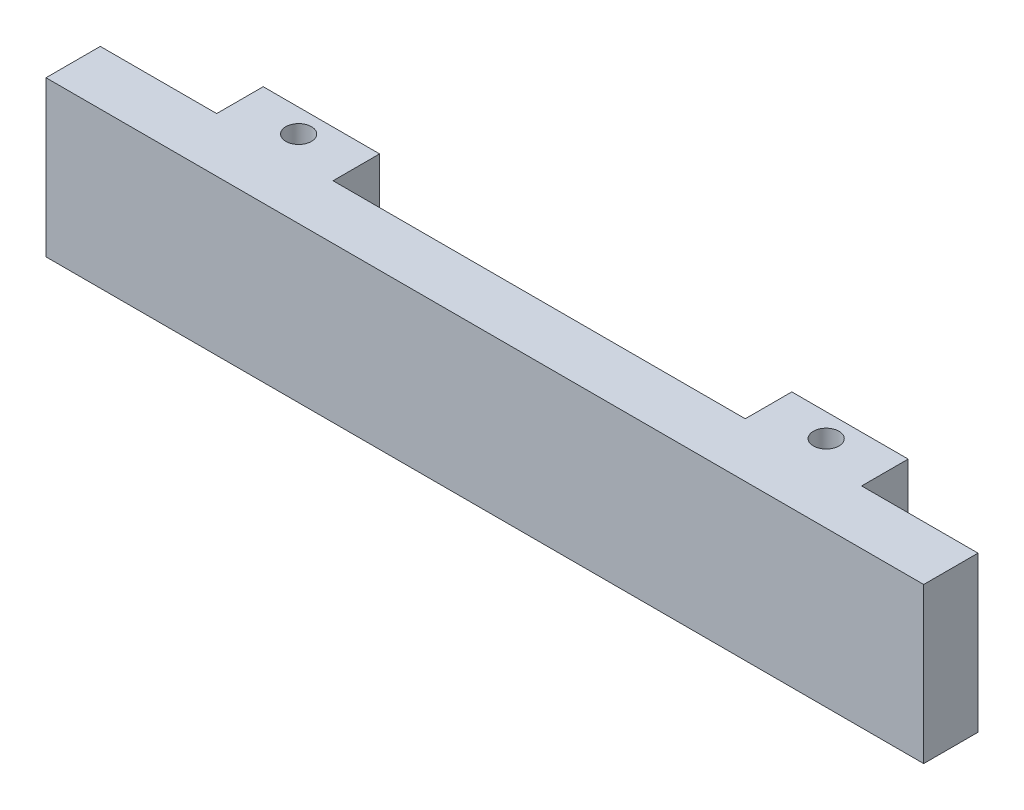
ISO-10303-21;
HEADER;
FILE_DESCRIPTION(('STEP AP214'),'2;1');
FILE_NAME('part.step','',(''),(''),'','','');
FILE_SCHEMA(('AUTOMOTIVE_DESIGN { 1 0 10303 214 1 1 1 1 }'));
ENDSEC;
DATA;
#1=APPLICATION_CONTEXT('core data for automotive mechanical design processes');
#2=APPLICATION_PROTOCOL_DEFINITION('international standard','automotive_design',2000,#1);
#3=PRODUCT_CONTEXT('',#1,'mechanical');
#4=PRODUCT('Part','Part','',(#3));
#5=PRODUCT_RELATED_PRODUCT_CATEGORY('part','',(#4));
#6=PRODUCT_DEFINITION_FORMATION('','',#4);
#7=PRODUCT_DEFINITION_CONTEXT('part definition',#1,'design');
#8=PRODUCT_DEFINITION('design','',#6,#7);
#9=PRODUCT_DEFINITION_SHAPE('','',#8);
#10=(LENGTH_UNIT() NAMED_UNIT(*) SI_UNIT(.MILLI.,.METRE.));
#11=(NAMED_UNIT(*) PLANE_ANGLE_UNIT() SI_UNIT($,.RADIAN.));
#12=(NAMED_UNIT(*) SI_UNIT($,.STERADIAN.) SOLID_ANGLE_UNIT());
#13=UNCERTAINTY_MEASURE_WITH_UNIT(LENGTH_MEASURE(1.E-05),#10,'distance_accuracy_value','');
#14=(GEOMETRIC_REPRESENTATION_CONTEXT(3) GLOBAL_UNCERTAINTY_ASSIGNED_CONTEXT((#13)) GLOBAL_UNIT_ASSIGNED_CONTEXT((#10,
#11,#12)) REPRESENTATION_CONTEXT('',''));
#15=CARTESIAN_POINT('',(0.,0.,0.));
#16=DIRECTION('',(0.,0.,1.));
#17=DIRECTION('',(1.,0.,0.));
#18=AXIS2_PLACEMENT_3D('',#15,#16,#17);
#19=CARTESIAN_POINT('',(56.57,-10.,-3.5));
#20=DIRECTION('',(0.,0.,1.));
#21=DIRECTION('',(1.,0.,0.));
#22=AXIS2_PLACEMENT_3D('',#19,#20,#21);
#23=PLANE('',#22);
#24=DIRECTION('',(-1.,0.,0.));
#25=VECTOR('',#24,1.);
#26=CARTESIAN_POINT('',(56.57,9.99999999999999,-3.5));
#27=LINE('',#26,#25);
#28=CARTESIAN_POINT('',(-41.57,9.99999999999999,-3.5));
#29=VERTEX_POINT('',#28);
#30=CARTESIAN_POINT('',(-56.57,9.99999999999999,-3.5));
#31=VERTEX_POINT('',#30);
#32=EDGE_CURVE('E46',#29,#31,#27,.T.);
#33=ORIENTED_EDGE('',*,*,#32,.F.);
#34=DIRECTION('',(0.,-1.,0.));
#35=VECTOR('',#34,1.);
#36=CARTESIAN_POINT('',(-41.57,-2.00000000000001,-3.5));
#37=LINE('',#36,#35);
#38=CARTESIAN_POINT('',(-41.57,-2.00000000000001,-3.5));
#39=VERTEX_POINT('',#38);
#40=EDGE_CURVE('E60',#29,#39,#37,.T.);
#41=ORIENTED_EDGE('',*,*,#40,.T.);
#42=DIRECTION('',(1.,0.,0.));
#43=VECTOR('',#42,1.);
#44=CARTESIAN_POINT('',(-26.57,-2.00000000000001,-3.5));
#45=LINE('',#44,#43);
#46=CARTESIAN_POINT('',(-26.57,-2.00000000000001,-3.5));
#47=VERTEX_POINT('',#46);
#48=EDGE_CURVE('E161',#39,#47,#45,.T.);
#49=ORIENTED_EDGE('',*,*,#48,.T.);
#50=DIRECTION('',(0.,1.,0.));
#51=VECTOR('',#50,1.);
#52=CARTESIAN_POINT('',(-26.57,-2.00000000000001,-3.5));
#53=LINE('',#52,#51);
#54=CARTESIAN_POINT('',(-26.57,9.99999999999999,-3.5));
#55=VERTEX_POINT('',#54);
#56=EDGE_CURVE('E178',#47,#55,#53,.T.);
#57=ORIENTED_EDGE('',*,*,#56,.T.);
#58=CARTESIAN_POINT('',(26.57,9.99999999999999,-3.5));
#59=VERTEX_POINT('',#58);
#60=EDGE_CURVE('E52',#59,#55,#27,.T.);
#61=ORIENTED_EDGE('',*,*,#60,.F.);
#62=DIRECTION('',(0.,1.,0.));
#63=VECTOR('',#62,1.);
#64=CARTESIAN_POINT('',(26.57,-2.00000000000001,-3.5));
#65=LINE('',#64,#63);
#66=CARTESIAN_POINT('',(26.57,-2.00000000000001,-3.5));
#67=VERTEX_POINT('',#66);
#68=EDGE_CURVE('E196',#67,#59,#65,.T.);
#69=ORIENTED_EDGE('',*,*,#68,.F.);
#70=DIRECTION('',(-1.,0.,0.));
#71=VECTOR('',#70,1.);
#72=CARTESIAN_POINT('',(26.57,-2.00000000000001,-3.5));
#73=LINE('',#72,#71);
#74=CARTESIAN_POINT('',(41.57,-2.00000000000001,-3.5));
#75=VERTEX_POINT('',#74);
#76=EDGE_CURVE('E71',#75,#67,#73,.T.);
#77=ORIENTED_EDGE('',*,*,#76,.F.);
#78=DIRECTION('',(0.,-1.,0.));
#79=VECTOR('',#78,1.);
#80=CARTESIAN_POINT('',(41.57,-2.00000000000001,-3.5));
#81=LINE('',#80,#79);
#82=CARTESIAN_POINT('',(41.57,9.99999999999999,-3.5));
#83=VERTEX_POINT('',#82);
#84=EDGE_CURVE('E150',#83,#75,#81,.T.);
#85=ORIENTED_EDGE('',*,*,#84,.F.);
#86=CARTESIAN_POINT('',(56.57,9.99999999999999,-3.5));
#87=VERTEX_POINT('',#86);
#88=EDGE_CURVE('E11',#87,#83,#27,.T.);
#89=ORIENTED_EDGE('',*,*,#88,.F.);
#90=DIRECTION('',(0.,1.,0.));
#91=VECTOR('',#90,1.);
#92=CARTESIAN_POINT('',(56.57,-10.,-3.5));
#93=LINE('',#92,#91);
#94=CARTESIAN_POINT('',(56.57,-10.,-3.5));
#95=VERTEX_POINT('',#94);
#96=EDGE_CURVE('E257',#95,#87,#93,.T.);
#97=ORIENTED_EDGE('',*,*,#96,.F.);
#98=DIRECTION('',(-1.,0.,0.));
#99=VECTOR('',#98,1.);
#100=CARTESIAN_POINT('',(56.57,-10.,-3.5));
#101=LINE('',#100,#99);
#102=CARTESIAN_POINT('',(-56.57,-10.,-3.5));
#103=VERTEX_POINT('',#102);
#104=EDGE_CURVE('E250',#95,#103,#101,.T.);
#105=ORIENTED_EDGE('',*,*,#104,.T.);
#106=DIRECTION('',(0.,1.,0.));
#107=VECTOR('',#106,1.);
#108=CARTESIAN_POINT('',(-56.57,-10.,-3.5));
#109=LINE('',#108,#107);
#110=EDGE_CURVE('E262',#103,#31,#109,.T.);
#111=ORIENTED_EDGE('',*,*,#110,.T.);
#112=EDGE_LOOP('',(#33,#41,#49,#57,#61,#69,#77,#85,#89,#97,#105,#111));
#113=FACE_BOUND('',#112,.T.);
#114=ADVANCED_FACE('F43',(#113),#23,.F.);
#115=CARTESIAN_POINT('',(56.57,9.99999999999999,3.5));
#116=DIRECTION('',(0.,-1.,0.));
#117=DIRECTION('',(0.,0.,-1.));
#118=AXIS2_PLACEMENT_3D('',#115,#116,#117);
#119=PLANE('',#118);
#120=CARTESIAN_POINT('',(-34.,9.99999999999999,-6.5));
#121=DIRECTION('',(0.,-1.,0.));
#122=DIRECTION('',(0.,0.,-1.));
#123=AXIS2_PLACEMENT_3D('',#120,#121,#122);
#124=CIRCLE('',#123,1.64999999999999);
#125=CARTESIAN_POINT('',(-34.,9.99999999999999,-8.14999999999999));
#126=VERTEX_POINT('',#125);
#127=EDGE_CURVE('E315',#126,#126,#124,.T.);
#128=ORIENTED_EDGE('',*,*,#127,.T.);
#129=EDGE_LOOP('',(#128));
#130=FACE_BOUND('',#129,.T.);
#131=CARTESIAN_POINT('',(34.,9.99999999999999,-6.5));
#132=DIRECTION('',(0.,-1.,0.));
#133=DIRECTION('',(0.,0.,-1.));
#134=AXIS2_PLACEMENT_3D('',#131,#132,#133);
#135=CIRCLE('',#134,1.64999999999999);
#136=CARTESIAN_POINT('',(34.,9.99999999999999,-8.14999999999999));
#137=VERTEX_POINT('',#136);
#138=EDGE_CURVE('E179',#137,#137,#135,.T.);
#139=ORIENTED_EDGE('',*,*,#138,.T.);
#140=EDGE_LOOP('',(#139));
#141=FACE_BOUND('',#140,.T.);
#142=DIRECTION('',(0.,0.,1.));
#143=VECTOR('',#142,1.);
#144=CARTESIAN_POINT('',(-56.57,9.99999999999999,3.5));
#145=LINE('',#144,#143);
#146=CARTESIAN_POINT('',(-56.57,9.99999999999999,3.5));
#147=VERTEX_POINT('',#146);
#148=EDGE_CURVE('E260',#31,#147,#145,.T.);
#149=ORIENTED_EDGE('',*,*,#148,.T.);
#150=DIRECTION('',(-1.,0.,0.));
#151=VECTOR('',#150,1.);
#152=CARTESIAN_POINT('',(56.57,9.99999999999999,3.5));
#153=LINE('',#152,#151);
#154=CARTESIAN_POINT('',(56.57,9.99999999999999,3.5));
#155=VERTEX_POINT('',#154);
#156=EDGE_CURVE('E240',#155,#147,#153,.T.);
#157=ORIENTED_EDGE('',*,*,#156,.F.);
#158=DIRECTION('',(0.,0.,1.));
#159=VECTOR('',#158,1.);
#160=CARTESIAN_POINT('',(56.57,9.99999999999999,3.5));
#161=LINE('',#160,#159);
#162=EDGE_CURVE('E268',#87,#155,#161,.T.);
#163=ORIENTED_EDGE('',*,*,#162,.F.);
#164=ORIENTED_EDGE('',*,*,#88,.T.);
#165=DIRECTION('',(0.,0.,1.));
#166=VECTOR('',#165,1.);
#167=CARTESIAN_POINT('',(41.57,9.99999999999999,-9.5));
#168=LINE('',#167,#166);
#169=CARTESIAN_POINT('',(41.57,9.99999999999999,-9.5));
#170=VERTEX_POINT('',#169);
#171=EDGE_CURVE('E205',#170,#83,#168,.T.);
#172=ORIENTED_EDGE('',*,*,#171,.F.);
#173=DIRECTION('',(1.,0.,0.));
#174=VECTOR('',#173,1.);
#175=CARTESIAN_POINT('',(26.57,9.99999999999999,-9.5));
#176=LINE('',#175,#174);
#177=CARTESIAN_POINT('',(26.57,9.99999999999999,-9.5));
#178=VERTEX_POINT('',#177);
#179=EDGE_CURVE('E202',#178,#170,#176,.T.);
#180=ORIENTED_EDGE('',*,*,#179,.F.);
#181=DIRECTION('',(0.,0.,1.));
#182=VECTOR('',#181,1.);
#183=CARTESIAN_POINT('',(26.57,9.99999999999999,-9.5));
#184=LINE('',#183,#182);
#185=EDGE_CURVE('E219',#178,#59,#184,.T.);
#186=ORIENTED_EDGE('',*,*,#185,.T.);
#187=ORIENTED_EDGE('',*,*,#60,.T.);
#188=DIRECTION('',(0.,0.,1.));
#189=VECTOR('',#188,1.);
#190=CARTESIAN_POINT('',(-26.57,9.99999999999999,-9.5));
#191=LINE('',#190,#189);
#192=CARTESIAN_POINT('',(-26.57,9.99999999999999,-9.5));
#193=VERTEX_POINT('',#192);
#194=EDGE_CURVE('E151',#193,#55,#191,.T.);
#195=ORIENTED_EDGE('',*,*,#194,.F.);
#196=DIRECTION('',(-1.,0.,0.));
#197=VECTOR('',#196,1.);
#198=CARTESIAN_POINT('',(-26.57,9.99999999999999,-9.5));
#199=LINE('',#198,#197);
#200=CARTESIAN_POINT('',(-41.57,9.99999999999999,-9.5));
#201=VERTEX_POINT('',#200);
#202=EDGE_CURVE('E157',#193,#201,#199,.T.);
#203=ORIENTED_EDGE('',*,*,#202,.T.);
#204=DIRECTION('',(0.,0.,1.));
#205=VECTOR('',#204,1.);
#206=CARTESIAN_POINT('',(-41.57,9.99999999999999,-9.5));
#207=LINE('',#206,#205);
#208=EDGE_CURVE('E142',#201,#29,#207,.T.);
#209=ORIENTED_EDGE('',*,*,#208,.T.);
#210=ORIENTED_EDGE('',*,*,#32,.T.);
#211=EDGE_LOOP('',(#149,#157,#163,#164,#172,#180,#186,#187,#195,#203,#209,#210));
#212=FACE_BOUND('',#211,.T.);
#213=ADVANCED_FACE('F163',(#130,#141,#212),#119,.F.);
#214=CARTESIAN_POINT('',(56.57,-10.,3.5));
#215=DIRECTION('',(0.,0.,-1.));
#216=DIRECTION('',(-1.,0.,0.));
#217=AXIS2_PLACEMENT_3D('',#214,#215,#216);
#218=PLANE('',#217);
#219=DIRECTION('',(0.,-1.,0.));
#220=VECTOR('',#219,1.);
#221=CARTESIAN_POINT('',(-56.57,-10.,3.5));
#222=LINE('',#221,#220);
#223=CARTESIAN_POINT('',(-56.57,-10.,3.5));
#224=VERTEX_POINT('',#223);
#225=EDGE_CURVE('E258',#147,#224,#222,.T.);
#226=ORIENTED_EDGE('',*,*,#225,.T.);
#227=DIRECTION('',(-1.,0.,0.));
#228=VECTOR('',#227,1.);
#229=CARTESIAN_POINT('',(56.57,-10.,3.5));
#230=LINE('',#229,#228);
#231=CARTESIAN_POINT('',(56.57,-10.,3.5));
#232=VERTEX_POINT('',#231);
#233=EDGE_CURVE('E246',#232,#224,#230,.T.);
#234=ORIENTED_EDGE('',*,*,#233,.F.);
#235=DIRECTION('',(0.,-1.,0.));
#236=VECTOR('',#235,1.);
#237=CARTESIAN_POINT('',(56.57,-10.,3.5));
#238=LINE('',#237,#236);
#239=EDGE_CURVE('E266',#155,#232,#238,.T.);
#240=ORIENTED_EDGE('',*,*,#239,.F.);
#241=ORIENTED_EDGE('',*,*,#156,.T.);
#242=EDGE_LOOP('',(#226,#234,#240,#241));
#243=FACE_BOUND('',#242,.T.);
#244=ADVANCED_FACE('F293',(#243),#218,.F.);
#245=CARTESIAN_POINT('',(56.57,-10.,3.5));
#246=DIRECTION('',(0.,1.,0.));
#247=DIRECTION('',(0.,0.,1.));
#248=AXIS2_PLACEMENT_3D('',#245,#246,#247);
#249=PLANE('',#248);
#250=DIRECTION('',(0.,0.,-1.));
#251=VECTOR('',#250,1.);
#252=CARTESIAN_POINT('',(-56.57,-10.,3.5));
#253=LINE('',#252,#251);
#254=EDGE_CURVE('E255',#224,#103,#253,.T.);
#255=ORIENTED_EDGE('',*,*,#254,.T.);
#256=ORIENTED_EDGE('',*,*,#104,.F.);
#257=DIRECTION('',(0.,0.,-1.));
#258=VECTOR('',#257,1.);
#259=CARTESIAN_POINT('',(56.57,-10.,3.5));
#260=LINE('',#259,#258);
#261=EDGE_CURVE('E254',#232,#95,#260,.T.);
#262=ORIENTED_EDGE('',*,*,#261,.F.);
#263=ORIENTED_EDGE('',*,*,#233,.T.);
#264=EDGE_LOOP('',(#255,#256,#262,#263));
#265=FACE_BOUND('',#264,.T.);
#266=ADVANCED_FACE('F295',(#265),#249,.F.);
#267=CARTESIAN_POINT('',(56.57,0.,0.));
#268=DIRECTION('',(-1.,0.,0.));
#269=DIRECTION('',(0.,0.,1.));
#270=AXIS2_PLACEMENT_3D('',#267,#268,#269);
#271=PLANE('',#270);
#272=ORIENTED_EDGE('',*,*,#96,.T.);
#273=ORIENTED_EDGE('',*,*,#162,.T.);
#274=ORIENTED_EDGE('',*,*,#239,.T.);
#275=ORIENTED_EDGE('',*,*,#261,.T.);
#276=EDGE_LOOP('',(#272,#273,#274,#275));
#277=FACE_BOUND('',#276,.T.);
#278=ADVANCED_FACE('F282',(#277),#271,.F.);
#279=CARTESIAN_POINT('',(-56.57,0.,0.));
#280=DIRECTION('',(-1.,0.,0.));
#281=DIRECTION('',(0.,0.,1.));
#282=AXIS2_PLACEMENT_3D('',#279,#280,#281);
#283=PLANE('',#282);
#284=ORIENTED_EDGE('',*,*,#110,.F.);
#285=ORIENTED_EDGE('',*,*,#254,.F.);
#286=ORIENTED_EDGE('',*,*,#225,.F.);
#287=ORIENTED_EDGE('',*,*,#148,.F.);
#288=EDGE_LOOP('',(#284,#285,#286,#287));
#289=FACE_BOUND('',#288,.T.);
#290=ADVANCED_FACE('F290',(#289),#283,.T.);
#291=CARTESIAN_POINT('',(41.57,-2.00000000000001,-9.5));
#292=DIRECTION('',(-1.,0.,0.));
#293=DIRECTION('',(0.,0.,1.));
#294=AXIS2_PLACEMENT_3D('',#291,#292,#293);
#295=PLANE('',#294);
#296=ORIENTED_EDGE('',*,*,#84,.T.);
#297=DIRECTION('',(0.,0.,1.));
#298=VECTOR('',#297,1.);
#299=CARTESIAN_POINT('',(41.57,-2.00000000000001,-9.5));
#300=LINE('',#299,#298);
#301=CARTESIAN_POINT('',(41.57,-2.00000000000001,-9.5));
#302=VERTEX_POINT('',#301);
#303=EDGE_CURVE('E227',#302,#75,#300,.T.);
#304=ORIENTED_EDGE('',*,*,#303,.F.);
#305=DIRECTION('',(0.,-1.,0.));
#306=VECTOR('',#305,1.);
#307=CARTESIAN_POINT('',(41.57,-2.00000000000001,-9.5));
#308=LINE('',#307,#306);
#309=EDGE_CURVE('E191',#170,#302,#308,.T.);
#310=ORIENTED_EDGE('',*,*,#309,.F.);
#311=ORIENTED_EDGE('',*,*,#171,.T.);
#312=EDGE_LOOP('',(#296,#304,#310,#311));
#313=FACE_BOUND('',#312,.T.);
#314=ADVANCED_FACE('F276',(#313),#295,.F.);
#315=CARTESIAN_POINT('',(26.57,-2.00000000000001,-9.5));
#316=DIRECTION('',(0.,1.,0.));
#317=DIRECTION('',(0.,0.,1.));
#318=AXIS2_PLACEMENT_3D('',#315,#316,#317);
#319=PLANE('',#318);
#320=CARTESIAN_POINT('',(34.,-2.00000000000001,-6.5));
#321=DIRECTION('',(0.,-1.,0.));
#322=DIRECTION('',(0.,0.,-1.));
#323=AXIS2_PLACEMENT_3D('',#320,#321,#322);
#324=CIRCLE('',#323,1.64999999999998);
#325=CARTESIAN_POINT('',(34.,-2.00000000000001,-8.14999999999998));
#326=VERTEX_POINT('',#325);
#327=EDGE_CURVE('E320',#326,#326,#324,.T.);
#328=ORIENTED_EDGE('',*,*,#327,.F.);
#329=EDGE_LOOP('',(#328));
#330=FACE_BOUND('',#329,.T.);
#331=ORIENTED_EDGE('',*,*,#76,.T.);
#332=DIRECTION('',(0.,0.,1.));
#333=VECTOR('',#332,1.);
#334=CARTESIAN_POINT('',(26.57,-2.00000000000001,-9.5));
#335=LINE('',#334,#333);
#336=CARTESIAN_POINT('',(26.57,-2.00000000000001,-9.5));
#337=VERTEX_POINT('',#336);
#338=EDGE_CURVE('E210',#337,#67,#335,.T.);
#339=ORIENTED_EDGE('',*,*,#338,.F.);
#340=DIRECTION('',(-1.,0.,0.));
#341=VECTOR('',#340,1.);
#342=CARTESIAN_POINT('',(26.57,-2.00000000000001,-9.5));
#343=LINE('',#342,#341);
#344=EDGE_CURVE('E195',#302,#337,#343,.T.);
#345=ORIENTED_EDGE('',*,*,#344,.F.);
#346=ORIENTED_EDGE('',*,*,#303,.T.);
#347=EDGE_LOOP('',(#331,#339,#345,#346));
#348=FACE_BOUND('',#347,.T.);
#349=ADVANCED_FACE('F274',(#330,#348),#319,.F.);
#350=CARTESIAN_POINT('',(26.57,-2.00000000000001,-9.5));
#351=DIRECTION('',(1.,0.,0.));
#352=DIRECTION('',(0.,0.,-1.));
#353=AXIS2_PLACEMENT_3D('',#350,#351,#352);
#354=PLANE('',#353);
#355=ORIENTED_EDGE('',*,*,#68,.T.);
#356=ORIENTED_EDGE('',*,*,#185,.F.);
#357=DIRECTION('',(0.,1.,0.));
#358=VECTOR('',#357,1.);
#359=CARTESIAN_POINT('',(26.57,-2.00000000000001,-9.5));
#360=LINE('',#359,#358);
#361=EDGE_CURVE('E199',#337,#178,#360,.T.);
#362=ORIENTED_EDGE('',*,*,#361,.F.);
#363=ORIENTED_EDGE('',*,*,#338,.T.);
#364=EDGE_LOOP('',(#355,#356,#362,#363));
#365=FACE_BOUND('',#364,.T.);
#366=ADVANCED_FACE('F352',(#365),#354,.F.);
#367=CARTESIAN_POINT('',(0.,0.,-9.5));
#368=DIRECTION('',(0.,0.,-1.));
#369=DIRECTION('',(-1.,0.,0.));
#370=AXIS2_PLACEMENT_3D('',#367,#368,#369);
#371=PLANE('',#370);
#372=ORIENTED_EDGE('',*,*,#309,.T.);
#373=ORIENTED_EDGE('',*,*,#344,.T.);
#374=ORIENTED_EDGE('',*,*,#361,.T.);
#375=ORIENTED_EDGE('',*,*,#179,.T.);
#376=EDGE_LOOP('',(#372,#373,#374,#375));
#377=FACE_BOUND('',#376,.T.);
#378=ADVANCED_FACE('F346',(#377),#371,.T.);
#379=CARTESIAN_POINT('',(-41.57,-2.00000000000001,-9.5));
#380=DIRECTION('',(-1.,0.,0.));
#381=DIRECTION('',(0.,0.,1.));
#382=AXIS2_PLACEMENT_3D('',#379,#380,#381);
#383=PLANE('',#382);
#384=ORIENTED_EDGE('',*,*,#40,.F.);
#385=ORIENTED_EDGE('',*,*,#208,.F.);
#386=DIRECTION('',(0.,-1.,0.));
#387=VECTOR('',#386,1.);
#388=CARTESIAN_POINT('',(-41.57,-2.00000000000001,-9.5));
#389=LINE('',#388,#387);
#390=CARTESIAN_POINT('',(-41.57,-2.00000000000001,-9.5));
#391=VERTEX_POINT('',#390);
#392=EDGE_CURVE('E145',#201,#391,#389,.T.);
#393=ORIENTED_EDGE('',*,*,#392,.T.);
#394=DIRECTION('',(0.,0.,1.));
#395=VECTOR('',#394,1.);
#396=CARTESIAN_POINT('',(-41.57,-2.00000000000001,-9.5));
#397=LINE('',#396,#395);
#398=EDGE_CURVE('E176',#391,#39,#397,.T.);
#399=ORIENTED_EDGE('',*,*,#398,.T.);
#400=EDGE_LOOP('',(#384,#385,#393,#399));
#401=FACE_BOUND('',#400,.T.);
#402=ADVANCED_FACE('F144',(#401),#383,.T.);
#403=CARTESIAN_POINT('',(-26.57,-2.00000000000001,-9.5));
#404=DIRECTION('',(1.,0.,0.));
#405=DIRECTION('',(0.,0.,-1.));
#406=AXIS2_PLACEMENT_3D('',#403,#404,#405);
#407=PLANE('',#406);
#408=ORIENTED_EDGE('',*,*,#56,.F.);
#409=DIRECTION('',(0.,0.,1.));
#410=VECTOR('',#409,1.);
#411=CARTESIAN_POINT('',(-26.57,-2.00000000000001,-9.5));
#412=LINE('',#411,#410);
#413=CARTESIAN_POINT('',(-26.57,-2.00000000000001,-9.5));
#414=VERTEX_POINT('',#413);
#415=EDGE_CURVE('E187',#414,#47,#412,.T.);
#416=ORIENTED_EDGE('',*,*,#415,.F.);
#417=DIRECTION('',(0.,1.,0.));
#418=VECTOR('',#417,1.);
#419=CARTESIAN_POINT('',(-26.57,-2.00000000000001,-9.5));
#420=LINE('',#419,#418);
#421=EDGE_CURVE('E166',#414,#193,#420,.T.);
#422=ORIENTED_EDGE('',*,*,#421,.T.);
#423=ORIENTED_EDGE('',*,*,#194,.T.);
#424=EDGE_LOOP('',(#408,#416,#422,#423));
#425=FACE_BOUND('',#424,.T.);
#426=ADVANCED_FACE('F336',(#425),#407,.T.);
#427=CARTESIAN_POINT('',(-26.57,-2.00000000000001,-9.5));
#428=DIRECTION('',(0.,-1.,0.));
#429=DIRECTION('',(0.,0.,-1.));
#430=AXIS2_PLACEMENT_3D('',#427,#428,#429);
#431=PLANE('',#430);
#432=CARTESIAN_POINT('',(-34.,-2.00000000000001,-6.5));
#433=DIRECTION('',(0.,-1.,0.));
#434=DIRECTION('',(0.,0.,-1.));
#435=AXIS2_PLACEMENT_3D('',#432,#433,#434);
#436=CIRCLE('',#435,1.64999999999998);
#437=CARTESIAN_POINT('',(-34.,-2.00000000000001,-8.14999999999998));
#438=VERTEX_POINT('',#437);
#439=EDGE_CURVE('E327',#438,#438,#436,.T.);
#440=ORIENTED_EDGE('',*,*,#439,.F.);
#441=EDGE_LOOP('',(#440));
#442=FACE_BOUND('',#441,.T.);
#443=ORIENTED_EDGE('',*,*,#48,.F.);
#444=ORIENTED_EDGE('',*,*,#398,.F.);
#445=DIRECTION('',(1.,0.,0.));
#446=VECTOR('',#445,1.);
#447=CARTESIAN_POINT('',(-26.57,-2.00000000000001,-9.5));
#448=LINE('',#447,#446);
#449=EDGE_CURVE('E160',#391,#414,#448,.T.);
#450=ORIENTED_EDGE('',*,*,#449,.T.);
#451=ORIENTED_EDGE('',*,*,#415,.T.);
#452=EDGE_LOOP('',(#443,#444,#450,#451));
#453=FACE_BOUND('',#452,.T.);
#454=ADVANCED_FACE('F333',(#442,#453),#431,.T.);
#455=CARTESIAN_POINT('',(0.,0.,-9.5));
#456=DIRECTION('',(0.,0.,-1.));
#457=DIRECTION('',(1.,0.,0.));
#458=AXIS2_PLACEMENT_3D('',#455,#456,#457);
#459=PLANE('',#458);
#460=ORIENTED_EDGE('',*,*,#392,.F.);
#461=ORIENTED_EDGE('',*,*,#202,.F.);
#462=ORIENTED_EDGE('',*,*,#421,.F.);
#463=ORIENTED_EDGE('',*,*,#449,.F.);
#464=EDGE_LOOP('',(#460,#461,#462,#463));
#465=FACE_BOUND('',#464,.T.);
#466=ADVANCED_FACE('F155',(#465),#459,.T.);
#467=CARTESIAN_POINT('',(34.,-2.00000000000001,-6.5));
#468=DIRECTION('',(0.,-1.,0.));
#469=DIRECTION('',(0.,0.,-1.));
#470=AXIS2_PLACEMENT_3D('',#467,#468,#469);
#471=CYLINDRICAL_SURFACE('',#470,1.64999999999999);
#472=ORIENTED_EDGE('',*,*,#138,.F.);
#473=EDGE_LOOP('',(#472));
#474=FACE_BOUND('',#473,.T.);
#475=ORIENTED_EDGE('',*,*,#327,.T.);
#476=EDGE_LOOP('',(#475));
#477=FACE_BOUND('',#476,.T.);
#478=ADVANCED_FACE('F404',(#474,#477),#471,.F.);
#479=CARTESIAN_POINT('',(-34.,-2.00000000000001,-6.5));
#480=DIRECTION('',(0.,-1.,0.));
#481=DIRECTION('',(0.,0.,-1.));
#482=AXIS2_PLACEMENT_3D('',#479,#480,#481);
#483=CYLINDRICAL_SURFACE('',#482,1.64999999999999);
#484=ORIENTED_EDGE('',*,*,#127,.F.);
#485=EDGE_LOOP('',(#484));
#486=FACE_BOUND('',#485,.T.);
#487=ORIENTED_EDGE('',*,*,#439,.T.);
#488=EDGE_LOOP('',(#487));
#489=FACE_BOUND('',#488,.T.);
#490=ADVANCED_FACE('F331',(#486,#489),#483,.F.);
#491=CLOSED_SHELL('',(#114,#213,#244,#266,#278,#290,#314,#349,#366,#378,#402,#426,#454,#466,
#478,#490));
#492=MANIFOLD_SOLID_BREP('B2',#491);
#493=ADVANCED_BREP_SHAPE_REPRESENTATION('',(#18,#492),#14);
#494=SHAPE_DEFINITION_REPRESENTATION(#9,#493);
ENDSEC;
END-ISO-10303-21;
